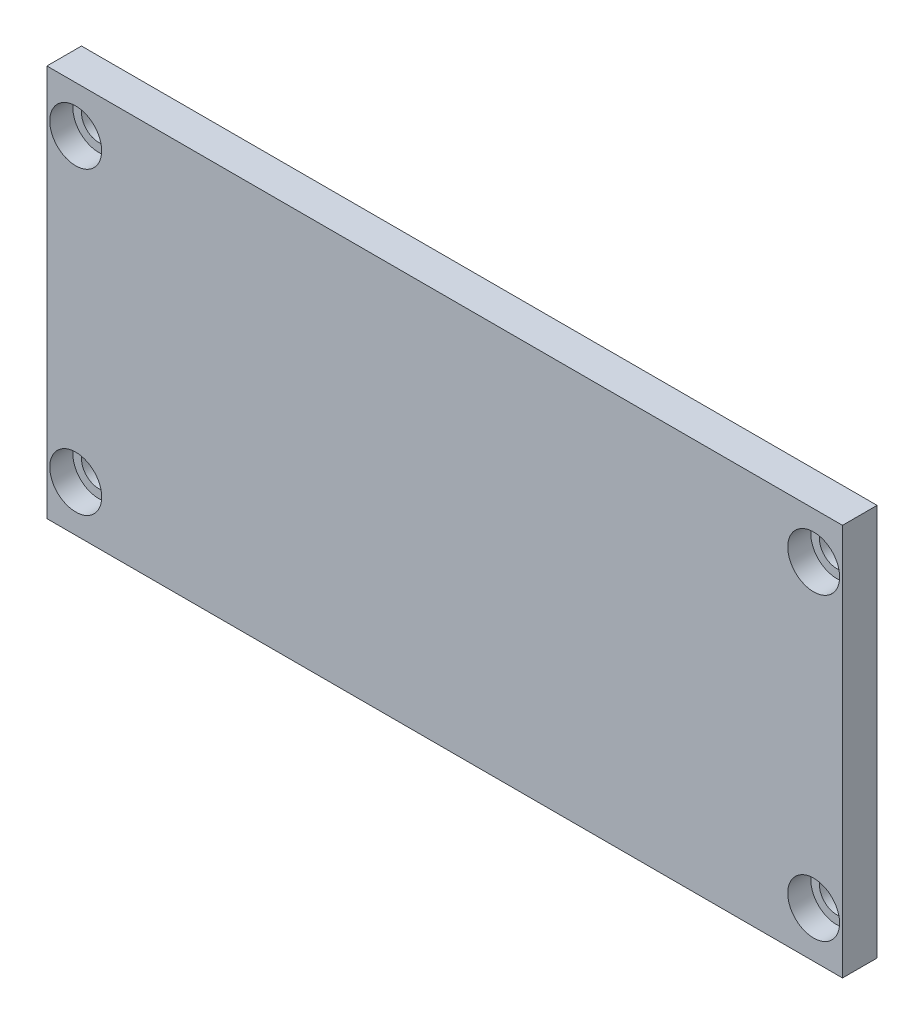
ISO-10303-21;
HEADER;
FILE_DESCRIPTION(('STEP AP214'),'2;1');
FILE_NAME('part.step','',(''),(''),'','','');
FILE_SCHEMA(('AUTOMOTIVE_DESIGN { 1 0 10303 214 1 1 1 1 }'));
ENDSEC;
DATA;
#1=APPLICATION_CONTEXT('core data for automotive mechanical design processes');
#2=APPLICATION_PROTOCOL_DEFINITION('international standard','automotive_design',2000,#1);
#3=PRODUCT_CONTEXT('',#1,'mechanical');
#4=PRODUCT('Part','Part','',(#3));
#5=PRODUCT_RELATED_PRODUCT_CATEGORY('part','',(#4));
#6=PRODUCT_DEFINITION_FORMATION('','',#4);
#7=PRODUCT_DEFINITION_CONTEXT('part definition',#1,'design');
#8=PRODUCT_DEFINITION('design','',#6,#7);
#9=PRODUCT_DEFINITION_SHAPE('','',#8);
#10=(LENGTH_UNIT() NAMED_UNIT(*) SI_UNIT(.MILLI.,.METRE.));
#11=(NAMED_UNIT(*) PLANE_ANGLE_UNIT() SI_UNIT($,.RADIAN.));
#12=(NAMED_UNIT(*) SI_UNIT($,.STERADIAN.) SOLID_ANGLE_UNIT());
#13=UNCERTAINTY_MEASURE_WITH_UNIT(LENGTH_MEASURE(1.E-05),#10,'distance_accuracy_value','');
#14=(GEOMETRIC_REPRESENTATION_CONTEXT(3) GLOBAL_UNCERTAINTY_ASSIGNED_CONTEXT((#13)) GLOBAL_UNIT_ASSIGNED_CONTEXT((#10,
#11,#12)) REPRESENTATION_CONTEXT('',''));
#15=CARTESIAN_POINT('',(0.,0.,0.));
#16=DIRECTION('',(0.,0.,1.));
#17=DIRECTION('',(1.,0.,0.));
#18=AXIS2_PLACEMENT_3D('',#15,#16,#17);
#19=CARTESIAN_POINT('',(2.5,30.,0.));
#20=DIRECTION('',(0.,0.,1.));
#21=DIRECTION('',(1.,0.,0.));
#22=AXIS2_PLACEMENT_3D('',#19,#20,#21);
#23=CYLINDRICAL_SURFACE('',#22,1.5);
#24=CARTESIAN_POINT('',(2.5,30.,0.));
#25=DIRECTION('',(0.,0.,1.));
#26=DIRECTION('',(1.,0.,0.));
#27=AXIS2_PLACEMENT_3D('',#24,#25,#26);
#28=CIRCLE('',#27,1.5);
#29=CARTESIAN_POINT('',(4.,30.,0.));
#30=VERTEX_POINT('',#29);
#31=EDGE_CURVE('E111',#30,#30,#28,.T.);
#32=ORIENTED_EDGE('',*,*,#31,.F.);
#33=EDGE_LOOP('',(#32));
#34=FACE_BOUND('',#33,.T.);
#35=CARTESIAN_POINT('',(2.5,30.,1.));
#36=DIRECTION('',(0.,0.,1.));
#37=DIRECTION('',(1.,0.,0.));
#38=AXIS2_PLACEMENT_3D('',#35,#36,#37);
#39=CIRCLE('',#38,1.5);
#40=CARTESIAN_POINT('',(4.,30.,1.));
#41=VERTEX_POINT('',#40);
#42=EDGE_CURVE('E45',#41,#41,#39,.F.);
#43=ORIENTED_EDGE('',*,*,#42,.F.);
#44=EDGE_LOOP('',(#43));
#45=FACE_BOUND('',#44,.T.);
#46=ADVANCED_FACE('F41',(#34,#45),#23,.F.);
#47=CARTESIAN_POINT('',(2.5,4.,0.));
#48=DIRECTION('',(0.,0.,1.));
#49=DIRECTION('',(1.,0.,0.));
#50=AXIS2_PLACEMENT_3D('',#47,#48,#49);
#51=CYLINDRICAL_SURFACE('',#50,1.5);
#52=CARTESIAN_POINT('',(2.5,4.,0.));
#53=DIRECTION('',(0.,0.,1.));
#54=DIRECTION('',(1.,0.,0.));
#55=AXIS2_PLACEMENT_3D('',#52,#53,#54);
#56=CIRCLE('',#55,1.5);
#57=CARTESIAN_POINT('',(4.,4.,0.));
#58=VERTEX_POINT('',#57);
#59=EDGE_CURVE('E137',#58,#58,#56,.T.);
#60=ORIENTED_EDGE('',*,*,#59,.F.);
#61=EDGE_LOOP('',(#60));
#62=FACE_BOUND('',#61,.T.);
#63=CARTESIAN_POINT('',(2.5,4.,1.));
#64=DIRECTION('',(0.,0.,1.));
#65=DIRECTION('',(1.,0.,0.));
#66=AXIS2_PLACEMENT_3D('',#63,#64,#65);
#67=CIRCLE('',#66,1.5);
#68=CARTESIAN_POINT('',(4.,4.,1.));
#69=VERTEX_POINT('',#68);
#70=EDGE_CURVE('E123',#69,#69,#67,.F.);
#71=ORIENTED_EDGE('',*,*,#70,.F.);
#72=EDGE_LOOP('',(#71));
#73=FACE_BOUND('',#72,.T.);
#74=ADVANCED_FACE('F196',(#62,#73),#51,.F.);
#75=CARTESIAN_POINT('',(66.5,4.,0.));
#76=DIRECTION('',(0.,0.,1.));
#77=DIRECTION('',(1.,0.,0.));
#78=AXIS2_PLACEMENT_3D('',#75,#76,#77);
#79=CYLINDRICAL_SURFACE('',#78,1.49999999999998);
#80=CARTESIAN_POINT('',(66.5,4.,0.));
#81=DIRECTION('',(0.,0.,1.));
#82=DIRECTION('',(1.,0.,0.));
#83=AXIS2_PLACEMENT_3D('',#80,#81,#82);
#84=CIRCLE('',#83,1.49999999999998);
#85=CARTESIAN_POINT('',(68.,4.,0.));
#86=VERTEX_POINT('',#85);
#87=EDGE_CURVE('E132',#86,#86,#84,.T.);
#88=ORIENTED_EDGE('',*,*,#87,.F.);
#89=EDGE_LOOP('',(#88));
#90=FACE_BOUND('',#89,.T.);
#91=CARTESIAN_POINT('',(66.5,4.,1.));
#92=DIRECTION('',(0.,0.,1.));
#93=DIRECTION('',(1.,0.,0.));
#94=AXIS2_PLACEMENT_3D('',#91,#92,#93);
#95=CIRCLE('',#94,1.49999999999998);
#96=CARTESIAN_POINT('',(68.,4.,1.));
#97=VERTEX_POINT('',#96);
#98=EDGE_CURVE('E120',#97,#97,#95,.F.);
#99=ORIENTED_EDGE('',*,*,#98,.F.);
#100=EDGE_LOOP('',(#99));
#101=FACE_BOUND('',#100,.T.);
#102=ADVANCED_FACE('F202',(#90,#101),#79,.F.);
#103=CARTESIAN_POINT('',(66.5,30.,0.));
#104=DIRECTION('',(0.,0.,1.));
#105=DIRECTION('',(1.,0.,0.));
#106=AXIS2_PLACEMENT_3D('',#103,#104,#105);
#107=CYLINDRICAL_SURFACE('',#106,1.5);
#108=CARTESIAN_POINT('',(66.5,30.,0.));
#109=DIRECTION('',(0.,0.,1.));
#110=DIRECTION('',(1.,0.,0.));
#111=AXIS2_PLACEMENT_3D('',#108,#109,#110);
#112=CIRCLE('',#111,1.5);
#113=CARTESIAN_POINT('',(68.,30.,0.));
#114=VERTEX_POINT('',#113);
#115=EDGE_CURVE('E128',#114,#114,#112,.T.);
#116=ORIENTED_EDGE('',*,*,#115,.F.);
#117=EDGE_LOOP('',(#116));
#118=FACE_BOUND('',#117,.T.);
#119=CARTESIAN_POINT('',(66.5,30.,1.));
#120=DIRECTION('',(0.,0.,1.));
#121=DIRECTION('',(1.,0.,0.));
#122=AXIS2_PLACEMENT_3D('',#119,#120,#121);
#123=CIRCLE('',#122,1.5);
#124=CARTESIAN_POINT('',(68.,30.,1.));
#125=VERTEX_POINT('',#124);
#126=EDGE_CURVE('E117',#125,#125,#123,.F.);
#127=ORIENTED_EDGE('',*,*,#126,.F.);
#128=EDGE_LOOP('',(#127));
#129=FACE_BOUND('',#128,.T.);
#130=ADVANCED_FACE('F206',(#118,#129),#107,.F.);
#131=CARTESIAN_POINT('',(69.,34.,3.));
#132=DIRECTION('',(-1.,0.,0.));
#133=DIRECTION('',(0.,-1.,0.));
#134=AXIS2_PLACEMENT_3D('',#131,#132,#133);
#135=PLANE('',#134);
#136=DIRECTION('',(0.,1.,0.));
#137=VECTOR('',#136,1.);
#138=CARTESIAN_POINT('',(69.,34.,0.));
#139=LINE('',#138,#137);
#140=CARTESIAN_POINT('',(69.,0.,0.));
#141=VERTEX_POINT('',#140);
#142=CARTESIAN_POINT('',(69.,34.,0.));
#143=VERTEX_POINT('',#142);
#144=EDGE_CURVE('E108',#141,#143,#139,.T.);
#145=ORIENTED_EDGE('',*,*,#144,.T.);
#146=DIRECTION('',(0.,0.,-1.));
#147=VECTOR('',#146,1.);
#148=CARTESIAN_POINT('',(69.,34.,3.));
#149=LINE('',#148,#147);
#150=CARTESIAN_POINT('',(69.,34.,3.));
#151=VERTEX_POINT('',#150);
#152=EDGE_CURVE('E12',#151,#143,#149,.T.);
#153=ORIENTED_EDGE('',*,*,#152,.F.);
#154=DIRECTION('',(0.,1.,0.));
#155=VECTOR('',#154,1.);
#156=CARTESIAN_POINT('',(69.,34.,3.));
#157=LINE('',#156,#155);
#158=CARTESIAN_POINT('',(69.,0.,3.));
#159=VERTEX_POINT('',#158);
#160=EDGE_CURVE('E95',#159,#151,#157,.T.);
#161=ORIENTED_EDGE('',*,*,#160,.F.);
#162=DIRECTION('',(0.,0.,-1.));
#163=VECTOR('',#162,1.);
#164=CARTESIAN_POINT('',(69.,0.,3.));
#165=LINE('',#164,#163);
#166=EDGE_CURVE('E104',#159,#141,#165,.T.);
#167=ORIENTED_EDGE('',*,*,#166,.T.);
#168=EDGE_LOOP('',(#145,#153,#161,#167));
#169=FACE_BOUND('',#168,.T.);
#170=ADVANCED_FACE('F43',(#169),#135,.F.);
#171=CARTESIAN_POINT('',(0.,34.,3.));
#172=DIRECTION('',(0.,-1.,0.));
#173=DIRECTION('',(0.,0.,-1.));
#174=AXIS2_PLACEMENT_3D('',#171,#172,#173);
#175=PLANE('',#174);
#176=DIRECTION('',(-1.,0.,0.));
#177=VECTOR('',#176,1.);
#178=CARTESIAN_POINT('',(0.,34.,0.));
#179=LINE('',#178,#177);
#180=CARTESIAN_POINT('',(0.,34.,0.));
#181=VERTEX_POINT('',#180);
#182=EDGE_CURVE('E99',#143,#181,#179,.T.);
#183=ORIENTED_EDGE('',*,*,#182,.T.);
#184=DIRECTION('',(0.,0.,-1.));
#185=VECTOR('',#184,1.);
#186=CARTESIAN_POINT('',(0.,34.,3.));
#187=LINE('',#186,#185);
#188=CARTESIAN_POINT('',(0.,34.,3.));
#189=VERTEX_POINT('',#188);
#190=EDGE_CURVE('E51',#189,#181,#187,.T.);
#191=ORIENTED_EDGE('',*,*,#190,.F.);
#192=DIRECTION('',(-1.,0.,0.));
#193=VECTOR('',#192,1.);
#194=CARTESIAN_POINT('',(0.,34.,3.));
#195=LINE('',#194,#193);
#196=EDGE_CURVE('E90',#151,#189,#195,.T.);
#197=ORIENTED_EDGE('',*,*,#196,.F.);
#198=ORIENTED_EDGE('',*,*,#152,.T.);
#199=EDGE_LOOP('',(#183,#191,#197,#198));
#200=FACE_BOUND('',#199,.T.);
#201=ADVANCED_FACE('F98',(#200),#175,.F.);
#202=CARTESIAN_POINT('',(0.,0.,3.));
#203=DIRECTION('',(1.,0.,0.));
#204=DIRECTION('',(0.,0.,-1.));
#205=AXIS2_PLACEMENT_3D('',#202,#203,#204);
#206=PLANE('',#205);
#207=DIRECTION('',(0.,-1.,0.));
#208=VECTOR('',#207,1.);
#209=CARTESIAN_POINT('',(0.,0.,0.));
#210=LINE('',#209,#208);
#211=CARTESIAN_POINT('',(0.,0.,0.));
#212=VERTEX_POINT('',#211);
#213=EDGE_CURVE('E77',#181,#212,#210,.T.);
#214=ORIENTED_EDGE('',*,*,#213,.T.);
#215=DIRECTION('',(0.,0.,-1.));
#216=VECTOR('',#215,1.);
#217=CARTESIAN_POINT('',(0.,0.,3.));
#218=LINE('',#217,#216);
#219=CARTESIAN_POINT('',(0.,0.,3.));
#220=VERTEX_POINT('',#219);
#221=EDGE_CURVE('E100',#220,#212,#218,.T.);
#222=ORIENTED_EDGE('',*,*,#221,.F.);
#223=DIRECTION('',(0.,-1.,0.));
#224=VECTOR('',#223,1.);
#225=CARTESIAN_POINT('',(0.,0.,3.));
#226=LINE('',#225,#224);
#227=EDGE_CURVE('E93',#189,#220,#226,.T.);
#228=ORIENTED_EDGE('',*,*,#227,.F.);
#229=ORIENTED_EDGE('',*,*,#190,.T.);
#230=EDGE_LOOP('',(#214,#222,#228,#229));
#231=FACE_BOUND('',#230,.T.);
#232=ADVANCED_FACE('F102',(#231),#206,.F.);
#233=CARTESIAN_POINT('',(69.,0.,3.));
#234=DIRECTION('',(0.,1.,0.));
#235=DIRECTION('',(0.,0.,1.));
#236=AXIS2_PLACEMENT_3D('',#233,#234,#235);
#237=PLANE('',#236);
#238=DIRECTION('',(1.,0.,0.));
#239=VECTOR('',#238,1.);
#240=CARTESIAN_POINT('',(69.,0.,0.));
#241=LINE('',#240,#239);
#242=EDGE_CURVE('E83',#212,#141,#241,.T.);
#243=ORIENTED_EDGE('',*,*,#242,.T.);
#244=ORIENTED_EDGE('',*,*,#166,.F.);
#245=DIRECTION('',(1.,0.,0.));
#246=VECTOR('',#245,1.);
#247=CARTESIAN_POINT('',(69.,0.,3.));
#248=LINE('',#247,#246);
#249=EDGE_CURVE('E60',#220,#159,#248,.T.);
#250=ORIENTED_EDGE('',*,*,#249,.F.);
#251=ORIENTED_EDGE('',*,*,#221,.T.);
#252=EDGE_LOOP('',(#243,#244,#250,#251));
#253=FACE_BOUND('',#252,.T.);
#254=ADVANCED_FACE('F177',(#253),#237,.F.);
#255=CARTESIAN_POINT('',(0.,0.,3.));
#256=DIRECTION('',(0.,0.,-1.));
#257=DIRECTION('',(-1.,0.,0.));
#258=AXIS2_PLACEMENT_3D('',#255,#256,#257);
#259=PLANE('',#258);
#260=CARTESIAN_POINT('',(66.5,30.,3.));
#261=DIRECTION('',(0.,0.,1.));
#262=DIRECTION('',(1.,0.,0.));
#263=AXIS2_PLACEMENT_3D('',#260,#261,#262);
#264=CIRCLE('',#263,2.25);
#265=CARTESIAN_POINT('',(68.75,30.,3.));
#266=VERTEX_POINT('',#265);
#267=EDGE_CURVE('E151',#266,#266,#264,.T.);
#268=ORIENTED_EDGE('',*,*,#267,.F.);
#269=EDGE_LOOP('',(#268));
#270=FACE_BOUND('',#269,.T.);
#271=CARTESIAN_POINT('',(2.5,4.,3.));
#272=DIRECTION('',(0.,0.,1.));
#273=DIRECTION('',(1.,0.,0.));
#274=AXIS2_PLACEMENT_3D('',#271,#272,#273);
#275=CIRCLE('',#274,2.25);
#276=CARTESIAN_POINT('',(4.75,4.,3.));
#277=VERTEX_POINT('',#276);
#278=EDGE_CURVE('E157',#277,#277,#275,.T.);
#279=ORIENTED_EDGE('',*,*,#278,.F.);
#280=EDGE_LOOP('',(#279));
#281=FACE_BOUND('',#280,.T.);
#282=CARTESIAN_POINT('',(66.5,4.,3.));
#283=DIRECTION('',(0.,0.,1.));
#284=DIRECTION('',(1.,0.,0.));
#285=AXIS2_PLACEMENT_3D('',#282,#283,#284);
#286=CIRCLE('',#285,2.25);
#287=CARTESIAN_POINT('',(68.75,4.,3.));
#288=VERTEX_POINT('',#287);
#289=EDGE_CURVE('E158',#288,#288,#286,.T.);
#290=ORIENTED_EDGE('',*,*,#289,.F.);
#291=EDGE_LOOP('',(#290));
#292=FACE_BOUND('',#291,.T.);
#293=CARTESIAN_POINT('',(2.5,30.,3.));
#294=DIRECTION('',(0.,0.,1.));
#295=DIRECTION('',(1.,0.,0.));
#296=AXIS2_PLACEMENT_3D('',#293,#294,#295);
#297=CIRCLE('',#296,2.25);
#298=CARTESIAN_POINT('',(4.75,30.,3.));
#299=VERTEX_POINT('',#298);
#300=EDGE_CURVE('E148',#299,#299,#297,.T.);
#301=ORIENTED_EDGE('',*,*,#300,.F.);
#302=EDGE_LOOP('',(#301));
#303=FACE_BOUND('',#302,.T.);
#304=ORIENTED_EDGE('',*,*,#160,.T.);
#305=ORIENTED_EDGE('',*,*,#196,.T.);
#306=ORIENTED_EDGE('',*,*,#227,.T.);
#307=ORIENTED_EDGE('',*,*,#249,.T.);
#308=EDGE_LOOP('',(#304,#305,#306,#307));
#309=FACE_BOUND('',#308,.T.);
#310=ADVANCED_FACE('F91',(#270,#281,#292,#303,#309),#259,.F.);
#311=CARTESIAN_POINT('',(0.,0.,0.));
#312=DIRECTION('',(0.,0.,-1.));
#313=DIRECTION('',(-1.,0.,0.));
#314=AXIS2_PLACEMENT_3D('',#311,#312,#313);
#315=PLANE('',#314);
#316=ORIENTED_EDGE('',*,*,#115,.T.);
#317=EDGE_LOOP('',(#316));
#318=FACE_BOUND('',#317,.T.);
#319=ORIENTED_EDGE('',*,*,#87,.T.);
#320=EDGE_LOOP('',(#319));
#321=FACE_BOUND('',#320,.T.);
#322=ORIENTED_EDGE('',*,*,#59,.T.);
#323=EDGE_LOOP('',(#322));
#324=FACE_BOUND('',#323,.T.);
#325=ORIENTED_EDGE('',*,*,#31,.T.);
#326=EDGE_LOOP('',(#325));
#327=FACE_BOUND('',#326,.T.);
#328=ORIENTED_EDGE('',*,*,#144,.F.);
#329=ORIENTED_EDGE('',*,*,#242,.F.);
#330=ORIENTED_EDGE('',*,*,#213,.F.);
#331=ORIENTED_EDGE('',*,*,#182,.F.);
#332=EDGE_LOOP('',(#328,#329,#330,#331));
#333=FACE_BOUND('',#332,.T.);
#334=ADVANCED_FACE('F176',(#318,#321,#324,#327,#333),#315,.T.);
#335=CARTESIAN_POINT('',(66.5,30.,1.));
#336=DIRECTION('',(0.,0.,1.));
#337=DIRECTION('',(1.,0.,0.));
#338=AXIS2_PLACEMENT_3D('',#335,#336,#337);
#339=PLANE('',#338);
#340=CARTESIAN_POINT('',(66.5,30.,1.));
#341=DIRECTION('',(0.,0.,1.));
#342=DIRECTION('',(1.,0.,0.));
#343=AXIS2_PLACEMENT_3D('',#340,#341,#342);
#344=CIRCLE('',#343,2.25);
#345=CARTESIAN_POINT('',(68.75,30.,1.));
#346=VERTEX_POINT('',#345);
#347=EDGE_CURVE('E161',#346,#346,#344,.T.);
#348=ORIENTED_EDGE('',*,*,#347,.T.);
#349=EDGE_LOOP('',(#348));
#350=FACE_BOUND('',#349,.T.);
#351=ORIENTED_EDGE('',*,*,#126,.T.);
#352=EDGE_LOOP('',(#351));
#353=FACE_BOUND('',#352,.T.);
#354=ADVANCED_FACE('F211',(#350,#353),#339,.T.);
#355=CARTESIAN_POINT('',(66.5,30.,1.));
#356=DIRECTION('',(0.,0.,1.));
#357=DIRECTION('',(1.,0.,0.));
#358=AXIS2_PLACEMENT_3D('',#355,#356,#357);
#359=CYLINDRICAL_SURFACE('',#358,2.25);
#360=ORIENTED_EDGE('',*,*,#347,.F.);
#361=EDGE_LOOP('',(#360));
#362=FACE_BOUND('',#361,.T.);
#363=ORIENTED_EDGE('',*,*,#267,.T.);
#364=EDGE_LOOP('',(#363));
#365=FACE_BOUND('',#364,.T.);
#366=ADVANCED_FACE('F234',(#362,#365),#359,.F.);
#367=CARTESIAN_POINT('',(66.5,4.,1.));
#368=DIRECTION('',(0.,0.,1.));
#369=DIRECTION('',(1.,0.,0.));
#370=AXIS2_PLACEMENT_3D('',#367,#368,#369);
#371=PLANE('',#370);
#372=CARTESIAN_POINT('',(66.5,4.,1.));
#373=DIRECTION('',(0.,0.,1.));
#374=DIRECTION('',(1.,0.,0.));
#375=AXIS2_PLACEMENT_3D('',#372,#373,#374);
#376=CIRCLE('',#375,2.25);
#377=CARTESIAN_POINT('',(68.75,4.,1.));
#378=VERTEX_POINT('',#377);
#379=EDGE_CURVE('E166',#378,#378,#376,.T.);
#380=ORIENTED_EDGE('',*,*,#379,.T.);
#381=EDGE_LOOP('',(#380));
#382=FACE_BOUND('',#381,.T.);
#383=ORIENTED_EDGE('',*,*,#98,.T.);
#384=EDGE_LOOP('',(#383));
#385=FACE_BOUND('',#384,.T.);
#386=ADVANCED_FACE('F240',(#382,#385),#371,.T.);
#387=CARTESIAN_POINT('',(66.5,4.,1.));
#388=DIRECTION('',(0.,0.,1.));
#389=DIRECTION('',(1.,0.,0.));
#390=AXIS2_PLACEMENT_3D('',#387,#388,#389);
#391=CYLINDRICAL_SURFACE('',#390,2.25);
#392=ORIENTED_EDGE('',*,*,#379,.F.);
#393=EDGE_LOOP('',(#392));
#394=FACE_BOUND('',#393,.T.);
#395=ORIENTED_EDGE('',*,*,#289,.T.);
#396=EDGE_LOOP('',(#395));
#397=FACE_BOUND('',#396,.T.);
#398=ADVANCED_FACE('F172',(#394,#397),#391,.F.);
#399=CARTESIAN_POINT('',(2.5,4.,1.));
#400=DIRECTION('',(0.,0.,1.));
#401=DIRECTION('',(1.,0.,0.));
#402=AXIS2_PLACEMENT_3D('',#399,#400,#401);
#403=PLANE('',#402);
#404=CARTESIAN_POINT('',(2.5,4.,1.));
#405=DIRECTION('',(0.,0.,1.));
#406=DIRECTION('',(1.,0.,0.));
#407=AXIS2_PLACEMENT_3D('',#404,#405,#406);
#408=CIRCLE('',#407,2.25);
#409=CARTESIAN_POINT('',(4.75,4.,1.));
#410=VERTEX_POINT('',#409);
#411=EDGE_CURVE('E154',#410,#410,#408,.T.);
#412=ORIENTED_EDGE('',*,*,#411,.T.);
#413=EDGE_LOOP('',(#412));
#414=FACE_BOUND('',#413,.T.);
#415=ORIENTED_EDGE('',*,*,#70,.T.);
#416=EDGE_LOOP('',(#415));
#417=FACE_BOUND('',#416,.T.);
#418=ADVANCED_FACE('F247',(#414,#417),#403,.T.);
#419=CARTESIAN_POINT('',(2.5,4.,1.));
#420=DIRECTION('',(0.,0.,1.));
#421=DIRECTION('',(1.,0.,0.));
#422=AXIS2_PLACEMENT_3D('',#419,#420,#421);
#423=CYLINDRICAL_SURFACE('',#422,2.25);
#424=ORIENTED_EDGE('',*,*,#411,.F.);
#425=EDGE_LOOP('',(#424));
#426=FACE_BOUND('',#425,.T.);
#427=ORIENTED_EDGE('',*,*,#278,.T.);
#428=EDGE_LOOP('',(#427));
#429=FACE_BOUND('',#428,.T.);
#430=ADVANCED_FACE('F190',(#426,#429),#423,.F.);
#431=CARTESIAN_POINT('',(2.5,30.,1.));
#432=DIRECTION('',(0.,0.,1.));
#433=DIRECTION('',(1.,0.,0.));
#434=AXIS2_PLACEMENT_3D('',#431,#432,#433);
#435=PLANE('',#434);
#436=CARTESIAN_POINT('',(2.5,30.,1.));
#437=DIRECTION('',(0.,0.,1.));
#438=DIRECTION('',(1.,0.,0.));
#439=AXIS2_PLACEMENT_3D('',#436,#437,#438);
#440=CIRCLE('',#439,2.25);
#441=CARTESIAN_POINT('',(4.75,30.,1.));
#442=VERTEX_POINT('',#441);
#443=EDGE_CURVE('E121',#442,#442,#440,.T.);
#444=ORIENTED_EDGE('',*,*,#443,.T.);
#445=EDGE_LOOP('',(#444));
#446=FACE_BOUND('',#445,.T.);
#447=ORIENTED_EDGE('',*,*,#42,.T.);
#448=EDGE_LOOP('',(#447));
#449=FACE_BOUND('',#448,.T.);
#450=ADVANCED_FACE('F184',(#446,#449),#435,.T.);
#451=CARTESIAN_POINT('',(2.5,30.,1.));
#452=DIRECTION('',(0.,0.,1.));
#453=DIRECTION('',(1.,0.,0.));
#454=AXIS2_PLACEMENT_3D('',#451,#452,#453);
#455=CYLINDRICAL_SURFACE('',#454,2.25);
#456=ORIENTED_EDGE('',*,*,#443,.F.);
#457=EDGE_LOOP('',(#456));
#458=FACE_BOUND('',#457,.T.);
#459=ORIENTED_EDGE('',*,*,#300,.T.);
#460=EDGE_LOOP('',(#459));
#461=FACE_BOUND('',#460,.T.);
#462=ADVANCED_FACE('F182',(#458,#461),#455,.F.);
#463=CLOSED_SHELL('',(#46,#74,#102,#130,#170,#201,#232,#254,#310,#334,#354,#366,#386,#398,#418,
#430,#450,#462));
#464=MANIFOLD_SOLID_BREP('B2',#463);
#465=ADVANCED_BREP_SHAPE_REPRESENTATION('',(#18,#464),#14);
#466=SHAPE_DEFINITION_REPRESENTATION(#9,#465);
ENDSEC;
END-ISO-10303-21;
